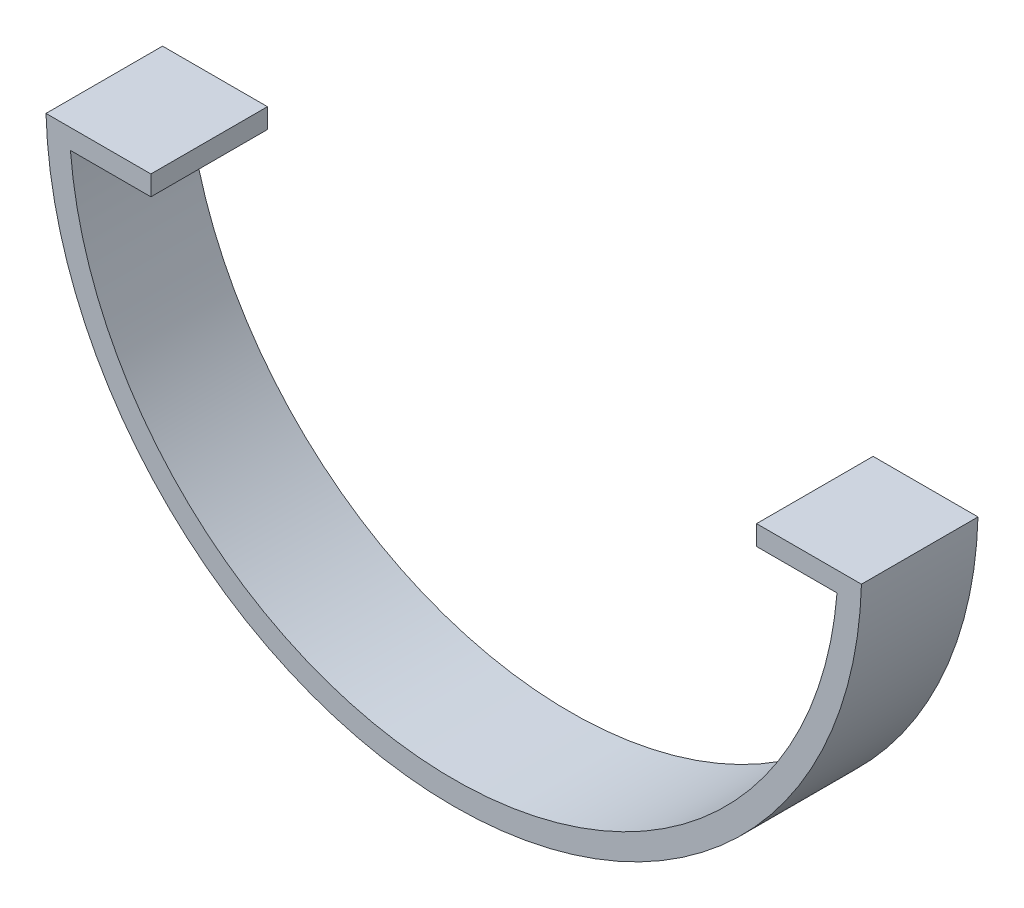
ISO-10303-21;
HEADER;
FILE_DESCRIPTION(('STEP AP214'),'2;1');
FILE_NAME('part.step','',(''),(''),'','','');
FILE_SCHEMA(('AUTOMOTIVE_DESIGN { 1 0 10303 214 1 1 1 1 }'));
ENDSEC;
DATA;
#1=APPLICATION_CONTEXT('core data for automotive mechanical design processes');
#2=APPLICATION_PROTOCOL_DEFINITION('international standard','automotive_design',2000,#1);
#3=PRODUCT_CONTEXT('',#1,'mechanical');
#4=PRODUCT('Part','Part','',(#3));
#5=PRODUCT_RELATED_PRODUCT_CATEGORY('part','',(#4));
#6=PRODUCT_DEFINITION_FORMATION('','',#4);
#7=PRODUCT_DEFINITION_CONTEXT('part definition',#1,'design');
#8=PRODUCT_DEFINITION('design','',#6,#7);
#9=PRODUCT_DEFINITION_SHAPE('','',#8);
#10=(LENGTH_UNIT() NAMED_UNIT(*) SI_UNIT(.MILLI.,.METRE.));
#11=(NAMED_UNIT(*) PLANE_ANGLE_UNIT() SI_UNIT($,.RADIAN.));
#12=(NAMED_UNIT(*) SI_UNIT($,.STERADIAN.) SOLID_ANGLE_UNIT());
#13=UNCERTAINTY_MEASURE_WITH_UNIT(LENGTH_MEASURE(1.E-05),#10,'distance_accuracy_value','');
#14=(GEOMETRIC_REPRESENTATION_CONTEXT(3) GLOBAL_UNCERTAINTY_ASSIGNED_CONTEXT((#13)) GLOBAL_UNIT_ASSIGNED_CONTEXT((#10,
#11,#12)) REPRESENTATION_CONTEXT('',''));
#15=CARTESIAN_POINT('',(0.,0.,0.));
#16=DIRECTION('',(0.,0.,1.));
#17=DIRECTION('',(1.,0.,0.));
#18=AXIS2_PLACEMENT_3D('',#15,#16,#17);
#19=CARTESIAN_POINT('',(-25.9848450049413,-1.,10.));
#20=DIRECTION('',(-1.,0.,0.));
#21=DIRECTION('',(0.,0.,1.));
#22=AXIS2_PLACEMENT_3D('',#19,#20,#21);
#23=PLANE('',#22);
#24=DIRECTION('',(0.,1.,0.));
#25=VECTOR('',#24,1.);
#26=CARTESIAN_POINT('',(-25.9848450049413,-1.,0.));
#27=LINE('',#26,#25);
#28=CARTESIAN_POINT('',(-25.9848450049413,-2.7,0.));
#29=VERTEX_POINT('',#28);
#30=CARTESIAN_POINT('',(-25.9848450049413,-1.,0.));
#31=VERTEX_POINT('',#30);
#32=EDGE_CURVE('E144',#29,#31,#27,.T.);
#33=ORIENTED_EDGE('',*,*,#32,.T.);
#34=DIRECTION('',(0.,0.,-1.));
#35=VECTOR('',#34,1.);
#36=CARTESIAN_POINT('',(-25.9848450049413,-1.,10.));
#37=LINE('',#36,#35);
#38=CARTESIAN_POINT('',(-25.9848450049413,-1.,10.));
#39=VERTEX_POINT('',#38);
#40=EDGE_CURVE('E11',#39,#31,#37,.T.);
#41=ORIENTED_EDGE('',*,*,#40,.F.);
#42=DIRECTION('',(0.,1.,0.));
#43=VECTOR('',#42,1.);
#44=CARTESIAN_POINT('',(-25.9848450049413,-1.,10.));
#45=LINE('',#44,#43);
#46=CARTESIAN_POINT('',(-25.9848450049413,-2.7,10.));
#47=VERTEX_POINT('',#46);
#48=EDGE_CURVE('E167',#47,#39,#45,.T.);
#49=ORIENTED_EDGE('',*,*,#48,.F.);
#50=DIRECTION('',(0.,0.,-1.));
#51=VECTOR('',#50,1.);
#52=CARTESIAN_POINT('',(-25.9848450049413,-2.7,10.));
#53=LINE('',#52,#51);
#54=EDGE_CURVE('E140',#47,#29,#53,.T.);
#55=ORIENTED_EDGE('',*,*,#54,.T.);
#56=EDGE_LOOP('',(#33,#41,#49,#55));
#57=FACE_BOUND('',#56,.T.);
#58=ADVANCED_FACE('F43',(#57),#23,.F.);
#59=CARTESIAN_POINT('',(-34.9857113690718,-1.,10.));
#60=DIRECTION('',(0.,-1.,0.));
#61=DIRECTION('',(0.,0.,-1.));
#62=AXIS2_PLACEMENT_3D('',#59,#60,#61);
#63=PLANE('',#62);
#64=DIRECTION('',(-1.,0.,0.));
#65=VECTOR('',#64,1.);
#66=CARTESIAN_POINT('',(-34.9857113690718,-1.,0.));
#67=LINE('',#66,#65);
#68=CARTESIAN_POINT('',(-34.9857113690718,-1.,0.));
#69=VERTEX_POINT('',#68);
#70=EDGE_CURVE('E148',#31,#69,#67,.T.);
#71=ORIENTED_EDGE('',*,*,#70,.T.);
#72=DIRECTION('',(0.,0.,-1.));
#73=VECTOR('',#72,1.);
#74=CARTESIAN_POINT('',(-34.9857113690718,-1.,10.));
#75=LINE('',#74,#73);
#76=CARTESIAN_POINT('',(-34.9857113690718,-1.,10.));
#77=VERTEX_POINT('',#76);
#78=EDGE_CURVE('E52',#77,#69,#75,.T.);
#79=ORIENTED_EDGE('',*,*,#78,.F.);
#80=DIRECTION('',(-1.,0.,0.));
#81=VECTOR('',#80,1.);
#82=CARTESIAN_POINT('',(-32.9848450049413,-1.,10.));
#83=LINE('',#82,#81);
#84=EDGE_CURVE('E103',#39,#77,#83,.T.);
#85=ORIENTED_EDGE('',*,*,#84,.F.);
#86=ORIENTED_EDGE('',*,*,#40,.T.);
#87=EDGE_LOOP('',(#71,#79,#85,#86));
#88=FACE_BOUND('',#87,.T.);
#89=ADVANCED_FACE('F212',(#88),#63,.F.);
#90=CARTESIAN_POINT('',(0.,0.,10.));
#91=DIRECTION('',(0.,0.,-1.));
#92=DIRECTION('',(-1.,0.,0.));
#93=AXIS2_PLACEMENT_3D('',#90,#91,#92);
#94=CYLINDRICAL_SURFACE('',#93,35.);
#95=CARTESIAN_POINT('',(0.,0.,0.));
#96=DIRECTION('',(0.,0.,1.));
#97=DIRECTION('',(1.,0.,0.));
#98=AXIS2_PLACEMENT_3D('',#95,#96,#97);
#99=CIRCLE('',#98,35.);
#100=CARTESIAN_POINT('',(34.9857113690718,-1.00000000000001,0.));
#101=VERTEX_POINT('',#100);
#102=EDGE_CURVE('E151',#69,#101,#99,.T.);
#103=ORIENTED_EDGE('',*,*,#102,.T.);
#104=DIRECTION('',(0.,0.,-1.));
#105=VECTOR('',#104,1.);
#106=CARTESIAN_POINT('',(34.9857113690718,-1.00000000000001,10.));
#107=LINE('',#106,#105);
#108=CARTESIAN_POINT('',(34.9857113690718,-1.00000000000001,10.));
#109=VERTEX_POINT('',#108);
#110=EDGE_CURVE('E178',#109,#101,#107,.T.);
#111=ORIENTED_EDGE('',*,*,#110,.F.);
#112=CARTESIAN_POINT('',(0.,0.,10.));
#113=DIRECTION('',(0.,0.,1.));
#114=DIRECTION('',(1.,0.,0.));
#115=AXIS2_PLACEMENT_3D('',#112,#113,#114);
#116=CIRCLE('',#115,35.);
#117=EDGE_CURVE('E188',#77,#109,#116,.T.);
#118=ORIENTED_EDGE('',*,*,#117,.F.);
#119=ORIENTED_EDGE('',*,*,#78,.T.);
#120=EDGE_LOOP('',(#103,#111,#118,#119));
#121=FACE_BOUND('',#120,.T.);
#122=ADVANCED_FACE('F186',(#121),#94,.T.);
#123=CARTESIAN_POINT('',(32.9848450049413,-1.,10.));
#124=DIRECTION('',(0.,-1.,0.));
#125=DIRECTION('',(0.,0.,-1.));
#126=AXIS2_PLACEMENT_3D('',#123,#124,#125);
#127=PLANE('',#126);
#128=DIRECTION('',(-1.,0.,0.));
#129=VECTOR('',#128,1.);
#130=CARTESIAN_POINT('',(32.9848450049413,-1.,0.));
#131=LINE('',#130,#129);
#132=CARTESIAN_POINT('',(25.9848450049413,-1.,0.));
#133=VERTEX_POINT('',#132);
#134=EDGE_CURVE('E155',#101,#133,#131,.T.);
#135=ORIENTED_EDGE('',*,*,#134,.T.);
#136=DIRECTION('',(0.,0.,-1.));
#137=VECTOR('',#136,1.);
#138=CARTESIAN_POINT('',(25.9848450049413,-1.,10.));
#139=LINE('',#138,#137);
#140=CARTESIAN_POINT('',(25.9848450049413,-1.,10.));
#141=VERTEX_POINT('',#140);
#142=EDGE_CURVE('E174',#141,#133,#139,.T.);
#143=ORIENTED_EDGE('',*,*,#142,.F.);
#144=DIRECTION('',(-1.,0.,0.));
#145=VECTOR('',#144,1.);
#146=CARTESIAN_POINT('',(32.9848450049413,-1.,10.));
#147=LINE('',#146,#145);
#148=EDGE_CURVE('E200',#109,#141,#147,.T.);
#149=ORIENTED_EDGE('',*,*,#148,.F.);
#150=ORIENTED_EDGE('',*,*,#110,.T.);
#151=EDGE_LOOP('',(#135,#143,#149,#150));
#152=FACE_BOUND('',#151,.T.);
#153=ADVANCED_FACE('F195',(#152),#127,.F.);
#154=CARTESIAN_POINT('',(25.9848450049413,-1.,10.));
#155=DIRECTION('',(1.,0.,0.));
#156=DIRECTION('',(0.,0.,-1.));
#157=AXIS2_PLACEMENT_3D('',#154,#155,#156);
#158=PLANE('',#157);
#159=DIRECTION('',(0.,-1.,0.));
#160=VECTOR('',#159,1.);
#161=CARTESIAN_POINT('',(25.9848450049413,-1.,0.));
#162=LINE('',#161,#160);
#163=CARTESIAN_POINT('',(25.9848450049413,-2.7,0.));
#164=VERTEX_POINT('',#163);
#165=EDGE_CURVE('E158',#133,#164,#162,.T.);
#166=ORIENTED_EDGE('',*,*,#165,.T.);
#167=DIRECTION('',(0.,0.,-1.));
#168=VECTOR('',#167,1.);
#169=CARTESIAN_POINT('',(25.9848450049413,-2.7,10.));
#170=LINE('',#169,#168);
#171=CARTESIAN_POINT('',(25.9848450049413,-2.7,10.));
#172=VERTEX_POINT('',#171);
#173=EDGE_CURVE('E133',#172,#164,#170,.T.);
#174=ORIENTED_EDGE('',*,*,#173,.F.);
#175=DIRECTION('',(0.,-1.,0.));
#176=VECTOR('',#175,1.);
#177=CARTESIAN_POINT('',(25.9848450049413,-1.,10.));
#178=LINE('',#177,#176);
#179=EDGE_CURVE('E122',#141,#172,#178,.T.);
#180=ORIENTED_EDGE('',*,*,#179,.F.);
#181=ORIENTED_EDGE('',*,*,#142,.T.);
#182=EDGE_LOOP('',(#166,#174,#180,#181));
#183=FACE_BOUND('',#182,.T.);
#184=ADVANCED_FACE('F198',(#183),#158,.F.);
#185=CARTESIAN_POINT('',(25.9848450049413,-2.7,10.));
#186=DIRECTION('',(0.,1.,0.));
#187=DIRECTION('',(-1.,0.,0.));
#188=AXIS2_PLACEMENT_3D('',#185,#186,#187);
#189=PLANE('',#188);
#190=DIRECTION('',(1.,0.,0.));
#191=VECTOR('',#190,1.);
#192=CARTESIAN_POINT('',(25.9848450049413,-2.7,0.));
#193=LINE('',#192,#191);
#194=CARTESIAN_POINT('',(32.8893599816111,-2.7,0.));
#195=VERTEX_POINT('',#194);
#196=EDGE_CURVE('E131',#164,#195,#193,.T.);
#197=ORIENTED_EDGE('',*,*,#196,.T.);
#198=DIRECTION('',(0.,0.,-1.));
#199=VECTOR('',#198,1.);
#200=CARTESIAN_POINT('',(32.8893599816111,-2.7,10.));
#201=LINE('',#200,#199);
#202=CARTESIAN_POINT('',(32.8893599816111,-2.7,10.));
#203=VERTEX_POINT('',#202);
#204=EDGE_CURVE('E128',#203,#195,#201,.T.);
#205=ORIENTED_EDGE('',*,*,#204,.F.);
#206=DIRECTION('',(1.,0.,0.));
#207=VECTOR('',#206,1.);
#208=CARTESIAN_POINT('',(25.9848450049413,-2.7,10.));
#209=LINE('',#208,#207);
#210=EDGE_CURVE('E116',#172,#203,#209,.T.);
#211=ORIENTED_EDGE('',*,*,#210,.F.);
#212=ORIENTED_EDGE('',*,*,#173,.T.);
#213=EDGE_LOOP('',(#197,#205,#211,#212));
#214=FACE_BOUND('',#213,.T.);
#215=ADVANCED_FACE('F129',(#214),#189,.F.);
#216=CARTESIAN_POINT('',(0.,0.,10.));
#217=DIRECTION('',(0.,0.,-1.));
#218=DIRECTION('',(-1.,0.,0.));
#219=AXIS2_PLACEMENT_3D('',#216,#217,#218);
#220=CYLINDRICAL_SURFACE('',#219,33.);
#221=CARTESIAN_POINT('',(0.,0.,0.));
#222=DIRECTION('',(0.,0.,-1.));
#223=DIRECTION('',(1.,0.,0.));
#224=AXIS2_PLACEMENT_3D('',#221,#222,#223);
#225=CIRCLE('',#224,33.);
#226=CARTESIAN_POINT('',(-32.8893599816111,-2.69999999999999,0.));
#227=VERTEX_POINT('',#226);
#228=EDGE_CURVE('E89',#195,#227,#225,.T.);
#229=ORIENTED_EDGE('',*,*,#228,.T.);
#230=DIRECTION('',(0.,0.,-1.));
#231=VECTOR('',#230,1.);
#232=CARTESIAN_POINT('',(-32.8893599816111,-2.69999999999999,10.));
#233=LINE('',#232,#231);
#234=CARTESIAN_POINT('',(-32.8893599816111,-2.69999999999999,10.));
#235=VERTEX_POINT('',#234);
#236=EDGE_CURVE('E134',#235,#227,#233,.T.);
#237=ORIENTED_EDGE('',*,*,#236,.F.);
#238=CARTESIAN_POINT('',(0.,0.,10.));
#239=DIRECTION('',(0.,0.,-1.));
#240=DIRECTION('',(1.,0.,0.));
#241=AXIS2_PLACEMENT_3D('',#238,#239,#240);
#242=CIRCLE('',#241,33.);
#243=EDGE_CURVE('E120',#203,#235,#242,.T.);
#244=ORIENTED_EDGE('',*,*,#243,.F.);
#245=ORIENTED_EDGE('',*,*,#204,.T.);
#246=EDGE_LOOP('',(#229,#237,#244,#245));
#247=FACE_BOUND('',#246,.T.);
#248=ADVANCED_FACE('F136',(#247),#220,.F.);
#249=CARTESIAN_POINT('',(-25.9848450049413,-2.7,10.));
#250=DIRECTION('',(0.,1.,0.));
#251=DIRECTION('',(-1.,0.,0.));
#252=AXIS2_PLACEMENT_3D('',#249,#250,#251);
#253=PLANE('',#252);
#254=DIRECTION('',(1.,0.,0.));
#255=VECTOR('',#254,1.);
#256=CARTESIAN_POINT('',(-25.9848450049413,-2.7,0.));
#257=LINE('',#256,#255);
#258=EDGE_CURVE('E95',#227,#29,#257,.T.);
#259=ORIENTED_EDGE('',*,*,#258,.T.);
#260=ORIENTED_EDGE('',*,*,#54,.F.);
#261=DIRECTION('',(1.,0.,0.));
#262=VECTOR('',#261,1.);
#263=CARTESIAN_POINT('',(-25.9848450049413,-2.7,10.));
#264=LINE('',#263,#262);
#265=EDGE_CURVE('E60',#235,#47,#264,.T.);
#266=ORIENTED_EDGE('',*,*,#265,.F.);
#267=ORIENTED_EDGE('',*,*,#236,.T.);
#268=EDGE_LOOP('',(#259,#260,#266,#267));
#269=FACE_BOUND('',#268,.T.);
#270=ADVANCED_FACE('F228',(#269),#253,.F.);
#271=CARTESIAN_POINT('',(0.,0.,10.));
#272=DIRECTION('',(0.,0.,1.));
#273=DIRECTION('',(1.,0.,0.));
#274=AXIS2_PLACEMENT_3D('',#271,#272,#273);
#275=PLANE('',#274);
#276=ORIENTED_EDGE('',*,*,#48,.T.);
#277=ORIENTED_EDGE('',*,*,#84,.T.);
#278=ORIENTED_EDGE('',*,*,#117,.T.);
#279=ORIENTED_EDGE('',*,*,#148,.T.);
#280=ORIENTED_EDGE('',*,*,#179,.T.);
#281=ORIENTED_EDGE('',*,*,#210,.T.);
#282=ORIENTED_EDGE('',*,*,#243,.T.);
#283=ORIENTED_EDGE('',*,*,#265,.T.);
#284=EDGE_LOOP('',(#276,#277,#278,#279,#280,#281,#282,#283));
#285=FACE_BOUND('',#284,.T.);
#286=ADVANCED_FACE('F118',(#285),#275,.T.);
#287=CARTESIAN_POINT('',(0.,0.,0.));
#288=DIRECTION('',(0.,0.,1.));
#289=DIRECTION('',(1.,0.,0.));
#290=AXIS2_PLACEMENT_3D('',#287,#288,#289);
#291=PLANE('',#290);
#292=ORIENTED_EDGE('',*,*,#32,.F.);
#293=ORIENTED_EDGE('',*,*,#258,.F.);
#294=ORIENTED_EDGE('',*,*,#228,.F.);
#295=ORIENTED_EDGE('',*,*,#196,.F.);
#296=ORIENTED_EDGE('',*,*,#165,.F.);
#297=ORIENTED_EDGE('',*,*,#134,.F.);
#298=ORIENTED_EDGE('',*,*,#102,.F.);
#299=ORIENTED_EDGE('',*,*,#70,.F.);
#300=EDGE_LOOP('',(#292,#293,#294,#295,#296,#297,#298,#299));
#301=FACE_BOUND('',#300,.T.);
#302=ADVANCED_FACE('F191',(#301),#291,.F.);
#303=CLOSED_SHELL('',(#58,#89,#122,#153,#184,#215,#248,#270,#286,#302));
#304=MANIFOLD_SOLID_BREP('B2',#303);
#305=ADVANCED_BREP_SHAPE_REPRESENTATION('',(#18,#304),#14);
#306=SHAPE_DEFINITION_REPRESENTATION(#9,#305);
ENDSEC;
END-ISO-10303-21;
